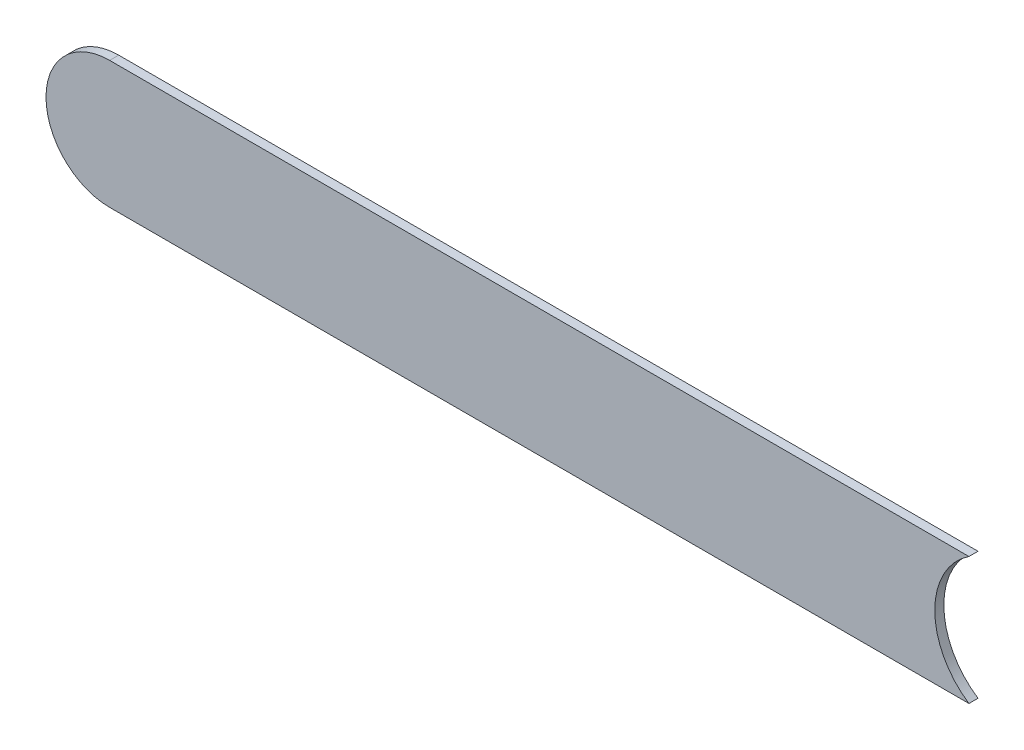
ISO-10303-21;
HEADER;
FILE_DESCRIPTION(('STEP AP214'),'2;1');
FILE_NAME('part.step','',(''),(''),'','','');
FILE_SCHEMA(('AUTOMOTIVE_DESIGN { 1 0 10303 214 1 1 1 1 }'));
ENDSEC;
DATA;
#1=APPLICATION_CONTEXT('core data for automotive mechanical design processes');
#2=APPLICATION_PROTOCOL_DEFINITION('international standard','automotive_design',2000,#1);
#3=PRODUCT_CONTEXT('',#1,'mechanical');
#4=PRODUCT('Part','Part','',(#3));
#5=PRODUCT_RELATED_PRODUCT_CATEGORY('part','',(#4));
#6=PRODUCT_DEFINITION_FORMATION('','',#4);
#7=PRODUCT_DEFINITION_CONTEXT('part definition',#1,'design');
#8=PRODUCT_DEFINITION('design','',#6,#7);
#9=PRODUCT_DEFINITION_SHAPE('','',#8);
#10=(LENGTH_UNIT() NAMED_UNIT(*) SI_UNIT(.MILLI.,.METRE.));
#11=(NAMED_UNIT(*) PLANE_ANGLE_UNIT() SI_UNIT($,.RADIAN.));
#12=(NAMED_UNIT(*) SI_UNIT($,.STERADIAN.) SOLID_ANGLE_UNIT());
#13=UNCERTAINTY_MEASURE_WITH_UNIT(LENGTH_MEASURE(1.E-05),#10,'distance_accuracy_value','');
#14=(GEOMETRIC_REPRESENTATION_CONTEXT(3) GLOBAL_UNCERTAINTY_ASSIGNED_CONTEXT((#13)) GLOBAL_UNIT_ASSIGNED_CONTEXT((#10,
#11,#12)) REPRESENTATION_CONTEXT('',''));
#15=CARTESIAN_POINT('',(0.,0.,0.));
#16=DIRECTION('',(0.,0.,1.));
#17=DIRECTION('',(1.,0.,0.));
#18=AXIS2_PLACEMENT_3D('',#15,#16,#17);
#19=CARTESIAN_POINT('',(39.859966,39.2499977,0.));
#20=DIRECTION('',(0.,1.,0.));
#21=DIRECTION('',(1.,0.,0.));
#22=AXIS2_PLACEMENT_3D('',#19,#20,#21);
#23=PLANE('',#22);
#24=DIRECTION('',(1.,0.,0.));
#25=VECTOR('',#24,1.);
#26=CARTESIAN_POINT('',(39.859966,39.2499977,0.03556));
#27=LINE('',#26,#25);
#28=CARTESIAN_POINT('',(39.859966,39.2499977,0.03556));
#29=VERTEX_POINT('',#28);
#30=CARTESIAN_POINT('',(43.2341838921447,39.2499977,0.03556));
#31=VERTEX_POINT('',#30);
#32=EDGE_CURVE('E11',#29,#31,#27,.T.);
#33=ORIENTED_EDGE('',*,*,#32,.F.);
#34=DIRECTION('',(0.,0.,1.));
#35=VECTOR('',#34,1.);
#36=CARTESIAN_POINT('',(39.859966,39.2499977,0.));
#37=LINE('',#36,#35);
#38=CARTESIAN_POINT('',(39.859966,39.2499977,0.));
#39=VERTEX_POINT('',#38);
#40=EDGE_CURVE('E24',#39,#29,#37,.T.);
#41=ORIENTED_EDGE('',*,*,#40,.F.);
#42=DIRECTION('',(1.,0.,0.));
#43=VECTOR('',#42,1.);
#44=CARTESIAN_POINT('',(39.859966,39.2499977,0.));
#45=LINE('',#44,#43);
#46=CARTESIAN_POINT('',(43.2341838921447,39.2499977,0.));
#47=VERTEX_POINT('',#46);
#48=EDGE_CURVE('E75',#39,#47,#45,.T.);
#49=ORIENTED_EDGE('',*,*,#48,.T.);
#50=DIRECTION('',(0.,0.,1.));
#51=VECTOR('',#50,1.);
#52=CARTESIAN_POINT('',(43.2341838921447,39.2499977,0.));
#53=LINE('',#52,#51);
#54=EDGE_CURVE('E37',#47,#31,#53,.T.);
#55=ORIENTED_EDGE('',*,*,#54,.T.);
#56=EDGE_LOOP('',(#33,#41,#49,#55));
#57=FACE_BOUND('',#56,.T.);
#58=ADVANCED_FACE('F17',(#57),#23,.F.);
#59=CARTESIAN_POINT('',(43.4000148,39.4999972,0.));
#60=DIRECTION('',(0.,0.,-1.));
#61=DIRECTION('',(1.,0.,0.));
#62=AXIS2_PLACEMENT_3D('',#59,#60,#61);
#63=CYLINDRICAL_SURFACE('',#62,0.2999994);
#64=DIRECTION('',(0.,0.,1.));
#65=VECTOR('',#64,1.);
#66=CARTESIAN_POINT('',(43.2341838921447,39.7499967,0.));
#67=LINE('',#66,#65);
#68=CARTESIAN_POINT('',(43.2341838921447,39.7499967,0.));
#69=VERTEX_POINT('',#68);
#70=CARTESIAN_POINT('',(43.2341838921447,39.7499967,0.03556));
#71=VERTEX_POINT('',#70);
#72=EDGE_CURVE('E67',#69,#71,#67,.T.);
#73=ORIENTED_EDGE('',*,*,#72,.T.);
#74=CARTESIAN_POINT('',(43.4000148,39.4999972,0.03556));
#75=DIRECTION('',(0.,0.,1.));
#76=DIRECTION('',(1.,0.,0.));
#77=AXIS2_PLACEMENT_3D('',#74,#75,#76);
#78=CIRCLE('',#77,0.2999994);
#79=EDGE_CURVE('E82',#71,#31,#78,.T.);
#80=ORIENTED_EDGE('',*,*,#79,.T.);
#81=ORIENTED_EDGE('',*,*,#54,.F.);
#82=CARTESIAN_POINT('',(43.4000148,39.4999972,0.));
#83=DIRECTION('',(0.,0.,1.));
#84=DIRECTION('',(1.,0.,0.));
#85=AXIS2_PLACEMENT_3D('',#82,#83,#84);
#86=CIRCLE('',#85,0.2999994);
#87=EDGE_CURVE('E80',#69,#47,#86,.T.);
#88=ORIENTED_EDGE('',*,*,#87,.F.);
#89=EDGE_LOOP('',(#73,#80,#81,#88));
#90=FACE_BOUND('',#89,.T.);
#91=ADVANCED_FACE('F88',(#90),#63,.F.);
#92=CARTESIAN_POINT('',(43.2341838921447,39.7499967,0.));
#93=DIRECTION('',(0.,-1.,0.));
#94=DIRECTION('',(-1.,0.,0.));
#95=AXIS2_PLACEMENT_3D('',#92,#93,#94);
#96=PLANE('',#95);
#97=DIRECTION('',(-1.,0.,0.));
#98=VECTOR('',#97,1.);
#99=CARTESIAN_POINT('',(43.4000148,39.7499967,0.03556));
#100=LINE('',#99,#98);
#101=CARTESIAN_POINT('',(39.859966,39.7499967,0.03556));
#102=VERTEX_POINT('',#101);
#103=EDGE_CURVE('E71',#71,#102,#100,.T.);
#104=ORIENTED_EDGE('',*,*,#103,.F.);
#105=ORIENTED_EDGE('',*,*,#72,.F.);
#106=DIRECTION('',(-1.,0.,0.));
#107=VECTOR('',#106,1.);
#108=CARTESIAN_POINT('',(43.4000148,39.7499967,0.));
#109=LINE('',#108,#107);
#110=CARTESIAN_POINT('',(39.859966,39.7499967,0.));
#111=VERTEX_POINT('',#110);
#112=EDGE_CURVE('E63',#69,#111,#109,.T.);
#113=ORIENTED_EDGE('',*,*,#112,.T.);
#114=DIRECTION('',(0.,0.,1.));
#115=VECTOR('',#114,1.);
#116=CARTESIAN_POINT('',(39.859966,39.7499967,0.));
#117=LINE('',#116,#115);
#118=EDGE_CURVE('E53',#111,#102,#117,.T.);
#119=ORIENTED_EDGE('',*,*,#118,.T.);
#120=EDGE_LOOP('',(#104,#105,#113,#119));
#121=FACE_BOUND('',#120,.T.);
#122=ADVANCED_FACE('F66',(#121),#96,.F.);
#123=CARTESIAN_POINT('',(39.859966,39.4999972,0.));
#124=DIRECTION('',(0.,0.,-1.));
#125=DIRECTION('',(0.,1.,0.));
#126=AXIS2_PLACEMENT_3D('',#123,#124,#125);
#127=CYLINDRICAL_SURFACE('',#126,0.249999500000001);
#128=CARTESIAN_POINT('',(39.859966,39.4999972,0.03556));
#129=DIRECTION('',(0.,0.,1.));
#130=DIRECTION('',(0.,1.,0.));
#131=AXIS2_PLACEMENT_3D('',#128,#129,#130);
#132=CIRCLE('',#131,0.249999500000001);
#133=EDGE_CURVE('E59',#102,#29,#132,.T.);
#134=ORIENTED_EDGE('',*,*,#133,.F.);
#135=ORIENTED_EDGE('',*,*,#118,.F.);
#136=CARTESIAN_POINT('',(39.859966,39.4999972,0.));
#137=DIRECTION('',(0.,0.,1.));
#138=DIRECTION('',(0.,1.,0.));
#139=AXIS2_PLACEMENT_3D('',#136,#137,#138);
#140=CIRCLE('',#139,0.249999500000001);
#141=EDGE_CURVE('E57',#111,#39,#140,.T.);
#142=ORIENTED_EDGE('',*,*,#141,.T.);
#143=ORIENTED_EDGE('',*,*,#40,.T.);
#144=EDGE_LOOP('',(#134,#135,#142,#143));
#145=FACE_BOUND('',#144,.T.);
#146=ADVANCED_FACE('F55',(#145),#127,.T.);
#147=CARTESIAN_POINT('',(39.859966,39.2499977,0.));
#148=DIRECTION('',(0.,0.,-1.));
#149=DIRECTION('',(-1.,0.,0.));
#150=AXIS2_PLACEMENT_3D('',#147,#148,#149);
#151=PLANE('',#150);
#152=ORIENTED_EDGE('',*,*,#48,.F.);
#153=ORIENTED_EDGE('',*,*,#141,.F.);
#154=ORIENTED_EDGE('',*,*,#112,.F.);
#155=ORIENTED_EDGE('',*,*,#87,.T.);
#156=EDGE_LOOP('',(#152,#153,#154,#155));
#157=FACE_BOUND('',#156,.T.);
#158=ADVANCED_FACE('F74',(#157),#151,.T.);
#159=CARTESIAN_POINT('',(39.859966,39.2499977,0.03556));
#160=DIRECTION('',(0.,0.,-1.));
#161=DIRECTION('',(-1.,0.,0.));
#162=AXIS2_PLACEMENT_3D('',#159,#160,#161);
#163=PLANE('',#162);
#164=ORIENTED_EDGE('',*,*,#133,.T.);
#165=ORIENTED_EDGE('',*,*,#32,.T.);
#166=ORIENTED_EDGE('',*,*,#79,.F.);
#167=ORIENTED_EDGE('',*,*,#103,.T.);
#168=EDGE_LOOP('',(#164,#165,#166,#167));
#169=FACE_BOUND('',#168,.T.);
#170=ADVANCED_FACE('F91',(#169),#163,.F.);
#171=CLOSED_SHELL('',(#58,#91,#122,#146,#158,#170));
#172=MANIFOLD_SOLID_BREP('B1',#171);
#173=ADVANCED_BREP_SHAPE_REPRESENTATION('',(#18,#172),#14);
#174=SHAPE_DEFINITION_REPRESENTATION(#9,#173);
ENDSEC;
END-ISO-10303-21;
